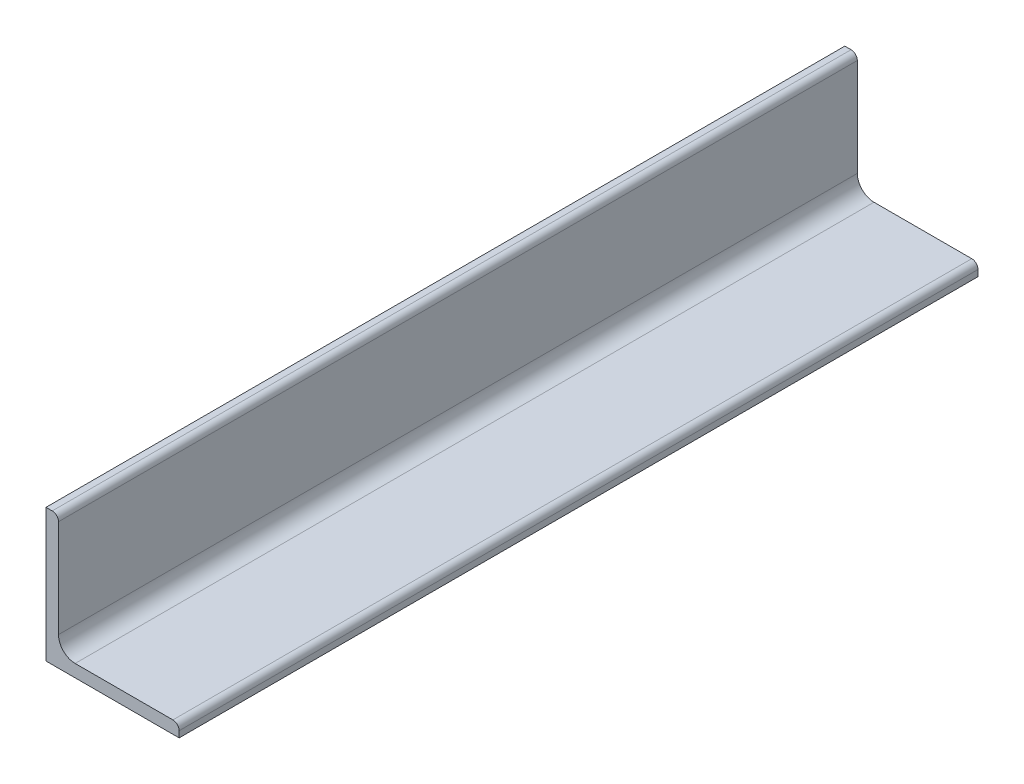
ISO-10303-21;
HEADER;
FILE_DESCRIPTION(('STEP AP214'),'2;1');
FILE_NAME('part.step','',(''),(''),'','','');
FILE_SCHEMA(('AUTOMOTIVE_DESIGN { 1 0 10303 214 1 1 1 1 }'));
ENDSEC;
DATA;
#1=APPLICATION_CONTEXT('core data for automotive mechanical design processes');
#2=APPLICATION_PROTOCOL_DEFINITION('international standard','automotive_design',2000,#1);
#3=PRODUCT_CONTEXT('',#1,'mechanical');
#4=PRODUCT('Part','Part','',(#3));
#5=PRODUCT_RELATED_PRODUCT_CATEGORY('part','',(#4));
#6=PRODUCT_DEFINITION_FORMATION('','',#4);
#7=PRODUCT_DEFINITION_CONTEXT('part definition',#1,'design');
#8=PRODUCT_DEFINITION('design','',#6,#7);
#9=PRODUCT_DEFINITION_SHAPE('','',#8);
#10=(LENGTH_UNIT() NAMED_UNIT(*) SI_UNIT(.MILLI.,.METRE.));
#11=(NAMED_UNIT(*) PLANE_ANGLE_UNIT() SI_UNIT($,.RADIAN.));
#12=(NAMED_UNIT(*) SI_UNIT($,.STERADIAN.) SOLID_ANGLE_UNIT());
#13=UNCERTAINTY_MEASURE_WITH_UNIT(LENGTH_MEASURE(1.E-05),#10,'distance_accuracy_value','');
#14=(GEOMETRIC_REPRESENTATION_CONTEXT(3) GLOBAL_UNCERTAINTY_ASSIGNED_CONTEXT((#13)) GLOBAL_UNIT_ASSIGNED_CONTEXT((#10,
#11,#12)) REPRESENTATION_CONTEXT('',''));
#15=CARTESIAN_POINT('',(0.,0.,0.));
#16=DIRECTION('',(0.,0.,1.));
#17=DIRECTION('',(1.,0.,0.));
#18=AXIS2_PLACEMENT_3D('',#15,#16,#17);
#19=CARTESIAN_POINT('',(0.116507760447575,51.418609434565,304.8));
#20=DIRECTION('',(1.,0.,0.));
#21=DIRECTION('',(0.,0.,-1.));
#22=AXIS2_PLACEMENT_3D('',#19,#20,#21);
#23=PLANE('',#22);
#24=DIRECTION('',(0.,-1.,0.));
#25=VECTOR('',#24,1.);
#26=CARTESIAN_POINT('',(0.116507760447575,51.418609434565,0.));
#27=LINE('',#26,#25);
#28=CARTESIAN_POINT('',(0.116507760447575,51.418609434565,0.));
#29=VERTEX_POINT('',#28);
#30=CARTESIAN_POINT('',(0.116507760447575,0.618609434565042,0.));
#31=VERTEX_POINT('',#30);
#32=EDGE_CURVE('E135',#29,#31,#27,.T.);
#33=ORIENTED_EDGE('',*,*,#32,.T.);
#34=DIRECTION('',(0.,0.,-1.));
#35=VECTOR('',#34,1.);
#36=CARTESIAN_POINT('',(0.116507760447575,0.618609434565042,304.8));
#37=LINE('',#36,#35);
#38=CARTESIAN_POINT('',(0.116507760447575,0.618609434565042,304.8));
#39=VERTEX_POINT('',#38);
#40=EDGE_CURVE('E11',#39,#31,#37,.T.);
#41=ORIENTED_EDGE('',*,*,#40,.F.);
#42=DIRECTION('',(0.,-1.,0.));
#43=VECTOR('',#42,1.);
#44=CARTESIAN_POINT('',(0.116507760447575,51.418609434565,304.8));
#45=LINE('',#44,#43);
#46=CARTESIAN_POINT('',(0.116507760447575,51.418609434565,304.8));
#47=VERTEX_POINT('',#46);
#48=EDGE_CURVE('E151',#47,#39,#45,.T.);
#49=ORIENTED_EDGE('',*,*,#48,.F.);
#50=DIRECTION('',(0.,0.,-1.));
#51=VECTOR('',#50,1.);
#52=CARTESIAN_POINT('',(0.116507760447575,51.418609434565,304.8));
#53=LINE('',#52,#51);
#54=EDGE_CURVE('E131',#47,#29,#53,.T.);
#55=ORIENTED_EDGE('',*,*,#54,.T.);
#56=EDGE_LOOP('',(#33,#41,#49,#55));
#57=FACE_BOUND('',#56,.T.);
#58=ADVANCED_FACE('F33',(#57),#23,.F.);
#59=CARTESIAN_POINT('',(0.116507760447575,0.618609434565042,304.8));
#60=DIRECTION('',(0.,1.,0.));
#61=DIRECTION('',(0.,0.,1.));
#62=AXIS2_PLACEMENT_3D('',#59,#60,#61);
#63=PLANE('',#62);
#64=DIRECTION('',(1.,0.,0.));
#65=VECTOR('',#64,1.);
#66=CARTESIAN_POINT('',(0.116507760447575,0.618609434565042,0.));
#67=LINE('',#66,#65);
#68=CARTESIAN_POINT('',(50.9165077604476,0.618609434565042,0.));
#69=VERTEX_POINT('',#68);
#70=EDGE_CURVE('E138',#31,#69,#67,.T.);
#71=ORIENTED_EDGE('',*,*,#70,.T.);
#72=DIRECTION('',(0.,0.,-1.));
#73=VECTOR('',#72,1.);
#74=CARTESIAN_POINT('',(50.9165077604476,0.618609434565042,304.8));
#75=LINE('',#74,#73);
#76=CARTESIAN_POINT('',(50.9165077604476,0.618609434565042,304.8));
#77=VERTEX_POINT('',#76);
#78=EDGE_CURVE('E41',#77,#69,#75,.T.);
#79=ORIENTED_EDGE('',*,*,#78,.F.);
#80=DIRECTION('',(1.,0.,0.));
#81=VECTOR('',#80,1.);
#82=CARTESIAN_POINT('',(0.116507760447575,0.618609434565042,304.8));
#83=LINE('',#82,#81);
#84=EDGE_CURVE('E95',#39,#77,#83,.T.);
#85=ORIENTED_EDGE('',*,*,#84,.F.);
#86=ORIENTED_EDGE('',*,*,#40,.T.);
#87=EDGE_LOOP('',(#71,#79,#85,#86));
#88=FACE_BOUND('',#87,.T.);
#89=ADVANCED_FACE('F194',(#88),#63,.F.);
#90=CARTESIAN_POINT('',(50.9165077604476,0.618609434565042,304.8));
#91=DIRECTION('',(-1.,0.,0.));
#92=DIRECTION('',(0.,0.,1.));
#93=AXIS2_PLACEMENT_3D('',#90,#91,#92);
#94=PLANE('',#93);
#95=DIRECTION('',(0.,1.,0.));
#96=VECTOR('',#95,1.);
#97=CARTESIAN_POINT('',(50.9165077604476,0.618609434565042,0.));
#98=LINE('',#97,#96);
#99=CARTESIAN_POINT('',(50.9165077604476,2.99985943456504,0.));
#100=VERTEX_POINT('',#99);
#101=EDGE_CURVE('E140',#69,#100,#98,.T.);
#102=ORIENTED_EDGE('',*,*,#101,.T.);
#103=DIRECTION('',(0.,0.,-1.));
#104=VECTOR('',#103,1.);
#105=CARTESIAN_POINT('',(50.9165077604476,2.99985943456504,304.8));
#106=LINE('',#105,#104);
#107=CARTESIAN_POINT('',(50.9165077604476,2.99985943456504,304.8));
#108=VERTEX_POINT('',#107);
#109=EDGE_CURVE('E161',#108,#100,#106,.T.);
#110=ORIENTED_EDGE('',*,*,#109,.F.);
#111=DIRECTION('',(0.,1.,0.));
#112=VECTOR('',#111,1.);
#113=CARTESIAN_POINT('',(50.9165077604476,0.618609434565042,304.8));
#114=LINE('',#113,#112);
#115=EDGE_CURVE('E169',#77,#108,#114,.T.);
#116=ORIENTED_EDGE('',*,*,#115,.F.);
#117=ORIENTED_EDGE('',*,*,#78,.T.);
#118=EDGE_LOOP('',(#102,#110,#116,#117));
#119=FACE_BOUND('',#118,.T.);
#120=ADVANCED_FACE('F167',(#119),#94,.F.);
#121=CARTESIAN_POINT('',(48.5352577604476,2.99985943456504,304.8));
#122=DIRECTION('',(0.,0.,-1.));
#123=DIRECTION('',(-1.,0.,0.));
#124=AXIS2_PLACEMENT_3D('',#121,#122,#123);
#125=CYLINDRICAL_SURFACE('',#124,2.38125);
#126=CARTESIAN_POINT('',(48.5352577604476,2.99985943456504,0.));
#127=DIRECTION('',(0.,0.,1.));
#128=DIRECTION('',(1.,0.,0.));
#129=AXIS2_PLACEMENT_3D('',#126,#127,#128);
#130=CIRCLE('',#129,2.38125);
#131=CARTESIAN_POINT('',(48.5352577604476,5.38110943456504,0.));
#132=VERTEX_POINT('',#131);
#133=EDGE_CURVE('E142',#100,#132,#130,.T.);
#134=ORIENTED_EDGE('',*,*,#133,.T.);
#135=DIRECTION('',(0.,0.,-1.));
#136=VECTOR('',#135,1.);
#137=CARTESIAN_POINT('',(48.5352577604476,5.38110943456504,304.8));
#138=LINE('',#137,#136);
#139=CARTESIAN_POINT('',(48.5352577604476,5.38110943456504,304.8));
#140=VERTEX_POINT('',#139);
#141=EDGE_CURVE('E158',#140,#132,#138,.T.);
#142=ORIENTED_EDGE('',*,*,#141,.F.);
#143=CARTESIAN_POINT('',(48.5352577604476,2.99985943456504,304.8));
#144=DIRECTION('',(0.,0.,1.));
#145=DIRECTION('',(1.,0.,0.));
#146=AXIS2_PLACEMENT_3D('',#143,#144,#145);
#147=CIRCLE('',#146,2.38125);
#148=EDGE_CURVE('E185',#108,#140,#147,.T.);
#149=ORIENTED_EDGE('',*,*,#148,.F.);
#150=ORIENTED_EDGE('',*,*,#109,.T.);
#151=EDGE_LOOP('',(#134,#142,#149,#150));
#152=FACE_BOUND('',#151,.T.);
#153=ADVANCED_FACE('F178',(#152),#125,.T.);
#154=CARTESIAN_POINT('',(48.5352577604476,5.38110943456504,304.8));
#155=DIRECTION('',(0.,-1.,0.));
#156=DIRECTION('',(0.,0.,-1.));
#157=AXIS2_PLACEMENT_3D('',#154,#155,#156);
#158=PLANE('',#157);
#159=DIRECTION('',(-1.,0.,0.));
#160=VECTOR('',#159,1.);
#161=CARTESIAN_POINT('',(48.5352577604476,5.38110943456504,0.));
#162=LINE('',#161,#160);
#163=CARTESIAN_POINT('',(11.2290077604476,5.38110943456504,0.));
#164=VERTEX_POINT('',#163);
#165=EDGE_CURVE('E144',#132,#164,#162,.T.);
#166=ORIENTED_EDGE('',*,*,#165,.T.);
#167=DIRECTION('',(0.,0.,-1.));
#168=VECTOR('',#167,1.);
#169=CARTESIAN_POINT('',(11.2290077604476,5.38110943456504,304.8));
#170=LINE('',#169,#168);
#171=CARTESIAN_POINT('',(11.2290077604476,5.38110943456504,304.8));
#172=VERTEX_POINT('',#171);
#173=EDGE_CURVE('E155',#172,#164,#170,.T.);
#174=ORIENTED_EDGE('',*,*,#173,.F.);
#175=DIRECTION('',(-1.,0.,0.));
#176=VECTOR('',#175,1.);
#177=CARTESIAN_POINT('',(48.5352577604476,5.38110943456504,304.8));
#178=LINE('',#177,#176);
#179=EDGE_CURVE('E184',#140,#172,#178,.T.);
#180=ORIENTED_EDGE('',*,*,#179,.F.);
#181=ORIENTED_EDGE('',*,*,#141,.T.);
#182=EDGE_LOOP('',(#166,#174,#180,#181));
#183=FACE_BOUND('',#182,.T.);
#184=ADVANCED_FACE('F182',(#183),#158,.F.);
#185=CARTESIAN_POINT('',(11.2290077604476,11.731109434565,304.8));
#186=DIRECTION('',(0.,0.,-1.));
#187=DIRECTION('',(-1.,0.,0.));
#188=AXIS2_PLACEMENT_3D('',#185,#186,#187);
#189=CYLINDRICAL_SURFACE('',#188,6.34999999999999);
#190=CARTESIAN_POINT('',(11.2290077604476,11.731109434565,0.));
#191=DIRECTION('',(0.,0.,-1.));
#192=DIRECTION('',(1.,0.,0.));
#193=AXIS2_PLACEMENT_3D('',#190,#191,#192);
#194=CIRCLE('',#193,6.34999999999999);
#195=CARTESIAN_POINT('',(4.87900776044758,11.731109434565,0.));
#196=VERTEX_POINT('',#195);
#197=EDGE_CURVE('E146',#164,#196,#194,.T.);
#198=ORIENTED_EDGE('',*,*,#197,.T.);
#199=DIRECTION('',(0.,0.,-1.));
#200=VECTOR('',#199,1.);
#201=CARTESIAN_POINT('',(4.87900776044758,11.731109434565,304.8));
#202=LINE('',#201,#200);
#203=CARTESIAN_POINT('',(4.87900776044758,11.731109434565,304.8));
#204=VERTEX_POINT('',#203);
#205=EDGE_CURVE('E126',#204,#196,#202,.T.);
#206=ORIENTED_EDGE('',*,*,#205,.F.);
#207=CARTESIAN_POINT('',(11.2290077604476,11.731109434565,304.8));
#208=DIRECTION('',(0.,0.,-1.));
#209=DIRECTION('',(1.,0.,0.));
#210=AXIS2_PLACEMENT_3D('',#207,#208,#209);
#211=CIRCLE('',#210,6.34999999999999);
#212=EDGE_CURVE('E117',#172,#204,#211,.T.);
#213=ORIENTED_EDGE('',*,*,#212,.F.);
#214=ORIENTED_EDGE('',*,*,#173,.T.);
#215=EDGE_LOOP('',(#198,#206,#213,#214));
#216=FACE_BOUND('',#215,.T.);
#217=ADVANCED_FACE('F206',(#216),#189,.F.);
#218=CARTESIAN_POINT('',(4.87900776044758,11.731109434565,304.8));
#219=DIRECTION('',(-1.,0.,0.));
#220=DIRECTION('',(0.,0.,1.));
#221=AXIS2_PLACEMENT_3D('',#218,#219,#220);
#222=PLANE('',#221);
#223=DIRECTION('',(0.,1.,0.));
#224=VECTOR('',#223,1.);
#225=CARTESIAN_POINT('',(4.87900776044758,11.731109434565,0.));
#226=LINE('',#225,#224);
#227=CARTESIAN_POINT('',(4.87900776044758,49.037359434565,0.));
#228=VERTEX_POINT('',#227);
#229=EDGE_CURVE('E125',#196,#228,#226,.T.);
#230=ORIENTED_EDGE('',*,*,#229,.T.);
#231=DIRECTION('',(0.,0.,-1.));
#232=VECTOR('',#231,1.);
#233=CARTESIAN_POINT('',(4.87900776044758,49.037359434565,304.8));
#234=LINE('',#233,#232);
#235=CARTESIAN_POINT('',(4.87900776044758,49.037359434565,304.8));
#236=VERTEX_POINT('',#235);
#237=EDGE_CURVE('E122',#236,#228,#234,.T.);
#238=ORIENTED_EDGE('',*,*,#237,.F.);
#239=DIRECTION('',(0.,1.,0.));
#240=VECTOR('',#239,1.);
#241=CARTESIAN_POINT('',(4.87900776044758,11.731109434565,304.8));
#242=LINE('',#241,#240);
#243=EDGE_CURVE('E111',#204,#236,#242,.T.);
#244=ORIENTED_EDGE('',*,*,#243,.F.);
#245=ORIENTED_EDGE('',*,*,#205,.T.);
#246=EDGE_LOOP('',(#230,#238,#244,#245));
#247=FACE_BOUND('',#246,.T.);
#248=ADVANCED_FACE('F123',(#247),#222,.F.);
#249=CARTESIAN_POINT('',(2.49775776044757,49.037359434565,304.8));
#250=DIRECTION('',(0.,0.,-1.));
#251=DIRECTION('',(-1.,0.,0.));
#252=AXIS2_PLACEMENT_3D('',#249,#250,#251);
#253=CYLINDRICAL_SURFACE('',#252,2.38125);
#254=CARTESIAN_POINT('',(2.49775776044757,49.037359434565,0.));
#255=DIRECTION('',(0.,0.,1.));
#256=DIRECTION('',(1.,0.,0.));
#257=AXIS2_PLACEMENT_3D('',#254,#255,#256);
#258=CIRCLE('',#257,2.38125);
#259=CARTESIAN_POINT('',(2.49775776044758,51.418609434565,0.));
#260=VERTEX_POINT('',#259);
#261=EDGE_CURVE('E81',#228,#260,#258,.T.);
#262=ORIENTED_EDGE('',*,*,#261,.T.);
#263=DIRECTION('',(0.,0.,-1.));
#264=VECTOR('',#263,1.);
#265=CARTESIAN_POINT('',(2.49775776044758,51.418609434565,304.8));
#266=LINE('',#265,#264);
#267=CARTESIAN_POINT('',(2.49775776044758,51.418609434565,304.8));
#268=VERTEX_POINT('',#267);
#269=EDGE_CURVE('E127',#268,#260,#266,.T.);
#270=ORIENTED_EDGE('',*,*,#269,.F.);
#271=CARTESIAN_POINT('',(2.49775776044757,49.037359434565,304.8));
#272=DIRECTION('',(0.,0.,1.));
#273=DIRECTION('',(1.,0.,0.));
#274=AXIS2_PLACEMENT_3D('',#271,#272,#273);
#275=CIRCLE('',#274,2.38125);
#276=EDGE_CURVE('E115',#236,#268,#275,.T.);
#277=ORIENTED_EDGE('',*,*,#276,.F.);
#278=ORIENTED_EDGE('',*,*,#237,.T.);
#279=EDGE_LOOP('',(#262,#270,#277,#278));
#280=FACE_BOUND('',#279,.T.);
#281=ADVANCED_FACE('F129',(#280),#253,.T.);
#282=CARTESIAN_POINT('',(2.49775776044758,51.418609434565,304.8));
#283=DIRECTION('',(0.,-1.,0.));
#284=DIRECTION('',(0.,0.,-1.));
#285=AXIS2_PLACEMENT_3D('',#282,#283,#284);
#286=PLANE('',#285);
#287=DIRECTION('',(-1.,0.,0.));
#288=VECTOR('',#287,1.);
#289=CARTESIAN_POINT('',(2.49775776044758,51.418609434565,0.));
#290=LINE('',#289,#288);
#291=EDGE_CURVE('E87',#260,#29,#290,.T.);
#292=ORIENTED_EDGE('',*,*,#291,.T.);
#293=ORIENTED_EDGE('',*,*,#54,.F.);
#294=DIRECTION('',(-1.,0.,0.));
#295=VECTOR('',#294,1.);
#296=CARTESIAN_POINT('',(2.49775776044758,51.418609434565,304.8));
#297=LINE('',#296,#295);
#298=EDGE_CURVE('E49',#268,#47,#297,.T.);
#299=ORIENTED_EDGE('',*,*,#298,.F.);
#300=ORIENTED_EDGE('',*,*,#269,.T.);
#301=EDGE_LOOP('',(#292,#293,#299,#300));
#302=FACE_BOUND('',#301,.T.);
#303=ADVANCED_FACE('F214',(#302),#286,.F.);
#304=CARTESIAN_POINT('',(48.5352577604476,2.99985943456504,304.8));
#305=DIRECTION('',(0.,0.,1.));
#306=DIRECTION('',(1.,0.,0.));
#307=AXIS2_PLACEMENT_3D('',#304,#305,#306);
#308=PLANE('',#307);
#309=ORIENTED_EDGE('',*,*,#48,.T.);
#310=ORIENTED_EDGE('',*,*,#84,.T.);
#311=ORIENTED_EDGE('',*,*,#115,.T.);
#312=ORIENTED_EDGE('',*,*,#148,.T.);
#313=ORIENTED_EDGE('',*,*,#179,.T.);
#314=ORIENTED_EDGE('',*,*,#212,.T.);
#315=ORIENTED_EDGE('',*,*,#243,.T.);
#316=ORIENTED_EDGE('',*,*,#276,.T.);
#317=ORIENTED_EDGE('',*,*,#298,.T.);
#318=EDGE_LOOP('',(#309,#310,#311,#312,#313,#314,#315,#316,#317));
#319=FACE_BOUND('',#318,.T.);
#320=ADVANCED_FACE('F113',(#319),#308,.T.);
#321=CARTESIAN_POINT('',(48.5352577604476,2.99985943456504,0.));
#322=DIRECTION('',(0.,0.,1.));
#323=DIRECTION('',(1.,0.,0.));
#324=AXIS2_PLACEMENT_3D('',#321,#322,#323);
#325=PLANE('',#324);
#326=ORIENTED_EDGE('',*,*,#32,.F.);
#327=ORIENTED_EDGE('',*,*,#291,.F.);
#328=ORIENTED_EDGE('',*,*,#261,.F.);
#329=ORIENTED_EDGE('',*,*,#229,.F.);
#330=ORIENTED_EDGE('',*,*,#197,.F.);
#331=ORIENTED_EDGE('',*,*,#165,.F.);
#332=ORIENTED_EDGE('',*,*,#133,.F.);
#333=ORIENTED_EDGE('',*,*,#101,.F.);
#334=ORIENTED_EDGE('',*,*,#70,.F.);
#335=EDGE_LOOP('',(#326,#327,#328,#329,#330,#331,#332,#333,#334));
#336=FACE_BOUND('',#335,.T.);
#337=ADVANCED_FACE('F173',(#336),#325,.F.);
#338=CLOSED_SHELL('',(#58,#89,#120,#153,#184,#217,#248,#281,#303,#320,#337));
#339=MANIFOLD_SOLID_BREP('B2',#338);
#340=ADVANCED_BREP_SHAPE_REPRESENTATION('',(#18,#339),#14);
#341=SHAPE_DEFINITION_REPRESENTATION(#9,#340);
ENDSEC;
END-ISO-10303-21;
